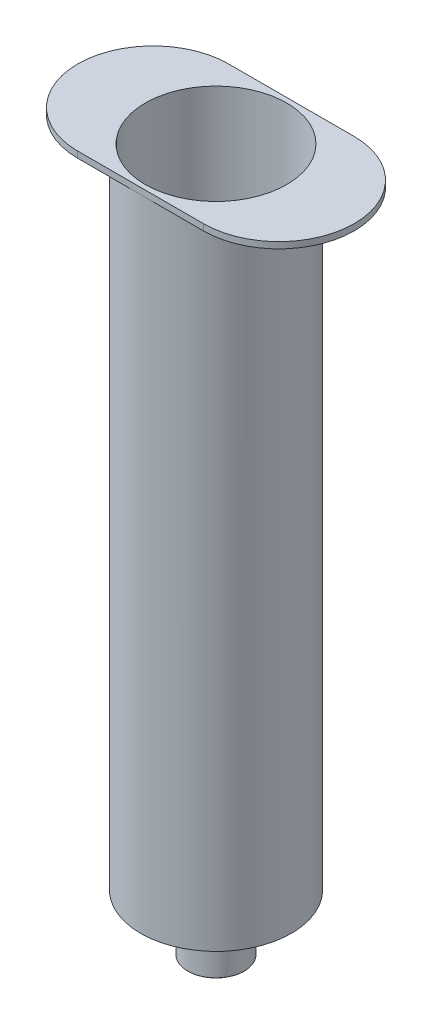
ISO-10303-21;
HEADER;
FILE_DESCRIPTION(('STEP AP214'),'2;1');
FILE_NAME('part.step','',(''),(''),'','','');
FILE_SCHEMA(('AUTOMOTIVE_DESIGN { 1 0 10303 214 1 1 1 1 }'));
ENDSEC;
DATA;
#1=APPLICATION_CONTEXT('core data for automotive mechanical design processes');
#2=APPLICATION_PROTOCOL_DEFINITION('international standard','automotive_design',2000,#1);
#3=PRODUCT_CONTEXT('',#1,'mechanical');
#4=PRODUCT('Part','Part','',(#3));
#5=PRODUCT_RELATED_PRODUCT_CATEGORY('part','',(#4));
#6=PRODUCT_DEFINITION_FORMATION('','',#4);
#7=PRODUCT_DEFINITION_CONTEXT('part definition',#1,'design');
#8=PRODUCT_DEFINITION('design','',#6,#7);
#9=PRODUCT_DEFINITION_SHAPE('','',#8);
#10=(LENGTH_UNIT() NAMED_UNIT(*) SI_UNIT(.MILLI.,.METRE.));
#11=(NAMED_UNIT(*) PLANE_ANGLE_UNIT() SI_UNIT($,.RADIAN.));
#12=(NAMED_UNIT(*) SI_UNIT($,.STERADIAN.) SOLID_ANGLE_UNIT());
#13=UNCERTAINTY_MEASURE_WITH_UNIT(LENGTH_MEASURE(1.E-05),#10,'distance_accuracy_value','');
#14=(GEOMETRIC_REPRESENTATION_CONTEXT(3) GLOBAL_UNCERTAINTY_ASSIGNED_CONTEXT((#13)) GLOBAL_UNIT_ASSIGNED_CONTEXT((#10,
#11,#12)) REPRESENTATION_CONTEXT('',''));
#15=CARTESIAN_POINT('',(0.,0.,0.));
#16=DIRECTION('',(0.,0.,1.));
#17=DIRECTION('',(1.,0.,0.));
#18=AXIS2_PLACEMENT_3D('',#15,#16,#17);
#19=CARTESIAN_POINT('',(0.,-6.73205080756888,0.));
#20=DIRECTION('',(0.,1.,0.));
#21=DIRECTION('',(0.,0.,1.));
#22=AXIS2_PLACEMENT_3D('',#19,#20,#21);
#23=CYLINDRICAL_SURFACE('',#22,1.4);
#24=CARTESIAN_POINT('',(0.,-6.53205080756888,0.));
#25=DIRECTION('',(0.,1.,0.));
#26=DIRECTION('',(0.,0.,1.));
#27=AXIS2_PLACEMENT_3D('',#24,#25,#26);
#28=CIRCLE('',#27,1.4);
#29=CARTESIAN_POINT('',(0.,-6.53205080756888,1.4));
#30=VERTEX_POINT('',#29);
#31=EDGE_CURVE('E51',#30,#30,#28,.T.);
#32=ORIENTED_EDGE('',*,*,#31,.T.);
#33=EDGE_LOOP('',(#32));
#34=FACE_BOUND('',#33,.T.);
#35=CARTESIAN_POINT('',(0.,0.26794919243112,0.));
#36=DIRECTION('',(0.,1.,0.));
#37=DIRECTION('',(0.,0.,1.));
#38=AXIS2_PLACEMENT_3D('',#35,#36,#37);
#39=CIRCLE('',#38,1.4);
#40=CARTESIAN_POINT('',(0.,0.26794919243112,1.4));
#41=VERTEX_POINT('',#40);
#42=EDGE_CURVE('E55',#41,#41,#39,.T.);
#43=ORIENTED_EDGE('',*,*,#42,.F.);
#44=EDGE_LOOP('',(#43));
#45=FACE_BOUND('',#44,.T.);
#46=ADVANCED_FACE('F44',(#34,#45),#23,.T.);
#47=CARTESIAN_POINT('',(0.,-6.73205080756888,0.));
#48=DIRECTION('',(0.,1.,0.));
#49=DIRECTION('',(0.,0.,1.));
#50=AXIS2_PLACEMENT_3D('',#47,#48,#49);
#51=PLANE('',#50);
#52=CARTESIAN_POINT('',(0.,-6.73205080756888,0.));
#53=DIRECTION('',(0.,1.,0.));
#54=DIRECTION('',(0.,0.,1.));
#55=AXIS2_PLACEMENT_3D('',#52,#53,#54);
#56=CIRCLE('',#55,1.2);
#57=CARTESIAN_POINT('',(0.,-6.73205080756888,1.2));
#58=VERTEX_POINT('',#57);
#59=EDGE_CURVE('E11',#58,#58,#56,.F.);
#60=ORIENTED_EDGE('',*,*,#59,.T.);
#61=EDGE_LOOP('',(#60));
#62=FACE_BOUND('',#61,.T.);
#63=CARTESIAN_POINT('',(0.,-6.73205080756888,0.));
#64=DIRECTION('',(0.,1.,0.));
#65=DIRECTION('',(0.,0.,1.));
#66=AXIS2_PLACEMENT_3D('',#63,#64,#65);
#67=CIRCLE('',#66,1.);
#68=CARTESIAN_POINT('',(0.,-6.73205080756888,1.));
#69=VERTEX_POINT('',#68);
#70=EDGE_CURVE('E59',#69,#69,#67,.T.);
#71=ORIENTED_EDGE('',*,*,#70,.T.);
#72=EDGE_LOOP('',(#71));
#73=FACE_BOUND('',#72,.T.);
#74=ADVANCED_FACE('F68',(#62,#73),#51,.F.);
#75=CARTESIAN_POINT('',(0.,0.26794919243112,0.));
#76=DIRECTION('',(0.,1.,0.));
#77=DIRECTION('',(0.,0.,1.));
#78=AXIS2_PLACEMENT_3D('',#75,#76,#77);
#79=PLANE('',#78);
#80=CARTESIAN_POINT('',(0.,0.26794919243112,0.));
#81=DIRECTION('',(0.,1.,0.));
#82=DIRECTION('',(0.,0.,1.));
#83=AXIS2_PLACEMENT_3D('',#80,#81,#82);
#84=CIRCLE('',#83,1.);
#85=CARTESIAN_POINT('',(0.,0.26794919243112,1.));
#86=VERTEX_POINT('',#85);
#87=EDGE_CURVE('E62',#86,#86,#84,.T.);
#88=ORIENTED_EDGE('',*,*,#87,.F.);
#89=EDGE_LOOP('',(#88));
#90=FACE_BOUND('',#89,.T.);
#91=ORIENTED_EDGE('',*,*,#42,.T.);
#92=EDGE_LOOP('',(#91));
#93=FACE_BOUND('',#92,.T.);
#94=ADVANCED_FACE('F73',(#90,#93),#79,.T.);
#95=CARTESIAN_POINT('',(0.,-6.73205080756888,0.));
#96=DIRECTION('',(0.,1.,0.));
#97=DIRECTION('',(0.,0.,1.));
#98=AXIS2_PLACEMENT_3D('',#95,#96,#97);
#99=CYLINDRICAL_SURFACE('',#98,1.);
#100=ORIENTED_EDGE('',*,*,#70,.F.);
#101=EDGE_LOOP('',(#100));
#102=FACE_BOUND('',#101,.T.);
#103=ORIENTED_EDGE('',*,*,#87,.T.);
#104=EDGE_LOOP('',(#103));
#105=FACE_BOUND('',#104,.T.);
#106=ADVANCED_FACE('F70',(#102,#105),#99,.F.);
#107=CARTESIAN_POINT('',(0.,-6.53205080756888,0.));
#108=DIRECTION('',(0.,1.,0.));
#109=DIRECTION('',(0.,0.,1.));
#110=AXIS2_PLACEMENT_3D('',#107,#108,#109);
#111=TOROIDAL_SURFACE('',#110,1.2,0.2);
#112=ORIENTED_EDGE('',*,*,#59,.F.);
#113=EDGE_LOOP('',(#112));
#114=FACE_BOUND('',#113,.T.);
#115=ORIENTED_EDGE('',*,*,#31,.F.);
#116=EDGE_LOOP('',(#115));
#117=FACE_BOUND('',#116,.T.);
#118=ADVANCED_FACE('F46',(#114,#117),#111,.T.);
#119=CLOSED_SHELL('',(#46,#74,#94,#106,#118));
#120=MANIFOLD_SOLID_BREP('B2',#119);
#121=CARTESIAN_POINT('',(0.,3.21539030917348,0.));
#122=DIRECTION('',(0.,1.,0.));
#123=DIRECTION('',(0.,0.,1.));
#124=AXIS2_PLACEMENT_3D('',#121,#122,#123);
#125=CONICAL_SURFACE('',#124,12.0000000000002,1.30899693899575);
#126=CARTESIAN_POINT('',(0.,3.21539030917348,0.));
#127=DIRECTION('',(0.,1.,0.));
#128=DIRECTION('',(0.,0.,1.));
#129=AXIS2_PLACEMENT_3D('',#126,#127,#128);
#130=CIRCLE('',#129,12.);
#131=CARTESIAN_POINT('',(0.,3.21539030917348,12.));
#132=VERTEX_POINT('',#131);
#133=EDGE_CURVE('E207',#132,#132,#130,.T.);
#134=ORIENTED_EDGE('',*,*,#133,.F.);
#135=EDGE_LOOP('',(#134));
#136=FACE_BOUND('',#135,.T.);
#137=CARTESIAN_POINT('',(0.,1.20577136594004,0.));
#138=DIRECTION('',(0.,1.,0.));
#139=DIRECTION('',(0.,0.,1.));
#140=AXIS2_PLACEMENT_3D('',#137,#138,#139);
#141=CIRCLE('',#140,4.5);
#142=CARTESIAN_POINT('',(0.,1.20577136594004,4.5));
#143=VERTEX_POINT('',#142);
#144=EDGE_CURVE('E191',#143,#143,#141,.T.);
#145=ORIENTED_EDGE('',*,*,#144,.T.);
#146=EDGE_LOOP('',(#145));
#147=FACE_BOUND('',#146,.T.);
#148=ADVANCED_FACE('F120',(#136,#147),#125,.T.);
#149=CARTESIAN_POINT('',(0.,105.,0.));
#150=DIRECTION('',(0.,-1.,0.));
#151=DIRECTION('',(0.,0.,-1.));
#152=AXIS2_PLACEMENT_3D('',#149,#150,#151);
#153=CYLINDRICAL_SURFACE('',#152,12.);
#154=ORIENTED_EDGE('',*,*,#133,.T.);
#155=EDGE_LOOP('',(#154));
#156=FACE_BOUND('',#155,.T.);
#157=CARTESIAN_POINT('',(0.,105.,0.));
#158=DIRECTION('',(0.,1.,0.));
#159=DIRECTION('',(0.,0.,1.));
#160=AXIS2_PLACEMENT_3D('',#157,#158,#159);
#161=CIRCLE('',#160,12.);
#162=CARTESIAN_POINT('',(0.,105.,12.));
#163=VERTEX_POINT('',#162);
#164=CARTESIAN_POINT('',(0.,105.,-12.));
#165=VERTEX_POINT('',#164);
#166=EDGE_CURVE('E137',#163,#165,#161,.T.);
#167=ORIENTED_EDGE('',*,*,#166,.F.);
#168=EDGE_CURVE('E134',#165,#163,#161,.T.);
#169=ORIENTED_EDGE('',*,*,#168,.F.);
#170=EDGE_LOOP('',(#167,#169));
#171=FACE_BOUND('',#170,.T.);
#172=ADVANCED_FACE('F241',(#156,#171),#153,.T.);
#173=CARTESIAN_POINT('',(0.,3.,0.));
#174=DIRECTION('',(0.,1.,0.));
#175=DIRECTION('',(0.,0.,1.));
#176=AXIS2_PLACEMENT_3D('',#173,#174,#175);
#177=CYLINDRICAL_SURFACE('',#176,11.25);
#178=CARTESIAN_POINT('',(0.,3.,0.));
#179=DIRECTION('',(0.,1.,0.));
#180=DIRECTION('',(0.,0.,1.));
#181=AXIS2_PLACEMENT_3D('',#178,#179,#180);
#182=CIRCLE('',#181,11.25);
#183=CARTESIAN_POINT('',(0.,3.,11.25));
#184=VERTEX_POINT('',#183);
#185=EDGE_CURVE('E203',#184,#184,#182,.T.);
#186=ORIENTED_EDGE('',*,*,#185,.F.);
#187=EDGE_LOOP('',(#186));
#188=FACE_BOUND('',#187,.T.);
#189=CARTESIAN_POINT('',(0.,106.,0.));
#190=DIRECTION('',(0.,1.,0.));
#191=DIRECTION('',(0.,0.,1.));
#192=AXIS2_PLACEMENT_3D('',#189,#190,#191);
#193=CIRCLE('',#192,11.25);
#194=CARTESIAN_POINT('',(0.,106.,11.25));
#195=VERTEX_POINT('',#194);
#196=EDGE_CURVE('E290',#195,#195,#193,.T.);
#197=ORIENTED_EDGE('',*,*,#196,.T.);
#198=EDGE_LOOP('',(#197));
#199=FACE_BOUND('',#198,.T.);
#200=ADVANCED_FACE('F248',(#188,#199),#177,.F.);
#201=CARTESIAN_POINT('',(0.,3.,0.));
#202=DIRECTION('',(0.,1.,0.));
#203=DIRECTION('',(0.,0.,1.));
#204=AXIS2_PLACEMENT_3D('',#201,#202,#203);
#205=PLANE('',#204);
#206=CARTESIAN_POINT('',(0.,3.,0.));
#207=DIRECTION('',(0.,1.,0.));
#208=DIRECTION('',(0.,0.,1.));
#209=AXIS2_PLACEMENT_3D('',#206,#207,#208);
#210=CIRCLE('',#209,1.);
#211=CARTESIAN_POINT('',(0.,3.,1.));
#212=VERTEX_POINT('',#211);
#213=EDGE_CURVE('E200',#212,#212,#210,.T.);
#214=ORIENTED_EDGE('',*,*,#213,.F.);
#215=EDGE_LOOP('',(#214));
#216=FACE_BOUND('',#215,.T.);
#217=ORIENTED_EDGE('',*,*,#185,.T.);
#218=EDGE_LOOP('',(#217));
#219=FACE_BOUND('',#218,.T.);
#220=ADVANCED_FACE('F255',(#216,#219),#205,.T.);
#221=CARTESIAN_POINT('',(0.,1.07179676972448,0.));
#222=DIRECTION('',(0.,1.,0.));
#223=DIRECTION('',(0.,0.,1.));
#224=AXIS2_PLACEMENT_3D('',#221,#222,#223);
#225=CIRCLE('',#224,4.);
#226=CARTESIAN_POINT('',(0.,1.07179676972448,4.));
#227=VERTEX_POINT('',#226);
#228=EDGE_CURVE('E210',#227,#227,#225,.T.);
#229=CARTESIAN_POINT('',(0.,0.26794919243112,0.));
#230=DIRECTION('',(0.,1.,0.));
#231=DIRECTION('',(0.,0.,1.));
#232=AXIS2_PLACEMENT_3D('',#229,#230,#231);
#233=CIRCLE('',#232,1.);
#234=CARTESIAN_POINT('',(0.,0.26794919243112,0.999999999999997));
#235=VERTEX_POINT('',#234);
#236=EDGE_CURVE('E194',#235,#235,#233,.F.);
#237=CARTESIAN_POINT('',(0.,1.07179676972448,4.));
#238=CARTESIAN_POINT('',(0.,1.06342335746101,3.96875));
#239=CARTESIAN_POINT('',(0.,1.05504994519753,3.9375));
#240=CARTESIAN_POINT('',(0.,1.03830312067059,3.875));
#241=CARTESIAN_POINT('',(0.,1.02992970840712,3.84375));
#242=CARTESIAN_POINT('',(0.,1.01318288388017,3.78125));
#243=CARTESIAN_POINT('',(0.,1.0048094716167,3.75));
#244=CARTESIAN_POINT('',(0.,0.988062647089754,3.6875));
#245=CARTESIAN_POINT('',(0.,0.979689234826281,3.65625));
#246=CARTESIAN_POINT('',(0.,0.962942410299336,3.59375));
#247=CARTESIAN_POINT('',(0.,0.954568998035863,3.5625));
#248=CARTESIAN_POINT('',(0.,0.937822173508919,3.5));
#249=CARTESIAN_POINT('',(0.,0.929448761245446,3.46875));
#250=CARTESIAN_POINT('',(0.,0.912701936718501,3.40625));
#251=CARTESIAN_POINT('',(0.,0.904328524455029,3.375));
#252=CARTESIAN_POINT('',(0.,0.887581699928084,3.3125));
#253=CARTESIAN_POINT('',(0.,0.879208287664611,3.28125));
#254=CARTESIAN_POINT('',(0.,0.862461463137666,3.21875));
#255=CARTESIAN_POINT('',(0.,0.854088050874194,3.1875));
#256=CARTESIAN_POINT('',(0.,0.837341226347249,3.125));
#257=CARTESIAN_POINT('',(0.,0.828967814083776,3.09375));
#258=CARTESIAN_POINT('',(0.,0.812220989556831,3.03125));
#259=CARTESIAN_POINT('',(0.,0.803847577293359,3.));
#260=CARTESIAN_POINT('',(0.,0.787100752766414,2.9375));
#261=CARTESIAN_POINT('',(0.,0.778727340502941,2.90625));
#262=CARTESIAN_POINT('',(0.,0.761980515975996,2.84375));
#263=CARTESIAN_POINT('',(0.,0.753607103712524,2.8125));
#264=CARTESIAN_POINT('',(0.,0.736860279185579,2.75));
#265=CARTESIAN_POINT('',(0.,0.728486866922107,2.71875));
#266=CARTESIAN_POINT('',(0.,0.711740042395162,2.65625));
#267=CARTESIAN_POINT('',(0.,0.703366630131689,2.625));
#268=CARTESIAN_POINT('',(0.,0.686619805604744,2.5625));
#269=CARTESIAN_POINT('',(0.,0.678246393341272,2.53125));
#270=CARTESIAN_POINT('',(0.,0.661499568814326,2.46875));
#271=CARTESIAN_POINT('',(0.,0.653126156550854,2.4375));
#272=CARTESIAN_POINT('',(0.,0.636379332023909,2.375));
#273=CARTESIAN_POINT('',(0.,0.628005919760437,2.34375));
#274=CARTESIAN_POINT('',(0.,0.611259095233492,2.28125));
#275=CARTESIAN_POINT('',(0.,0.602885682970019,2.25));
#276=CARTESIAN_POINT('',(0.,0.586138858443074,2.1875));
#277=CARTESIAN_POINT('',(0.,0.577765446179602,2.15625));
#278=CARTESIAN_POINT('',(0.,0.561018621652657,2.09375));
#279=CARTESIAN_POINT('',(0.,0.552645209389184,2.0625));
#280=CARTESIAN_POINT('',(0.,0.535898384862239,2.));
#281=CARTESIAN_POINT('',(0.,0.527524972598767,1.96875));
#282=CARTESIAN_POINT('',(0.,0.510778148071822,1.90625));
#283=CARTESIAN_POINT('',(0.,0.50240473580835,1.875));
#284=CARTESIAN_POINT('',(0.,0.485657911281404,1.8125));
#285=CARTESIAN_POINT('',(0.,0.477284499017932,1.78125));
#286=CARTESIAN_POINT('',(0.,0.460537674490987,1.71875));
#287=CARTESIAN_POINT('',(0.,0.452164262227514,1.6875));
#288=CARTESIAN_POINT('',(0.,0.435417437700569,1.625));
#289=CARTESIAN_POINT('',(0.,0.427044025437097,1.59375));
#290=CARTESIAN_POINT('',(0.,0.410297200910152,1.53125));
#291=CARTESIAN_POINT('',(0.,0.401923788646679,1.5));
#292=CARTESIAN_POINT('',(0.,0.385176964119735,1.4375));
#293=CARTESIAN_POINT('',(0.,0.376803551856262,1.40625));
#294=CARTESIAN_POINT('',(0.,0.360056727329317,1.34375));
#295=CARTESIAN_POINT('',(0.,0.351683315065844,1.3125));
#296=CARTESIAN_POINT('',(0.,0.3349364905389,1.25));
#297=CARTESIAN_POINT('',(0.,0.326563078275427,1.21875));
#298=CARTESIAN_POINT('',(0.,0.309816253748482,1.15625));
#299=CARTESIAN_POINT('',(0.,0.30144284148501,1.125));
#300=CARTESIAN_POINT('',(0.,0.284696016958065,1.0625));
#301=CARTESIAN_POINT('',(0.,0.276322604694592,1.03125));
#302=CARTESIAN_POINT('',(0.,0.26794919243112,0.999999999999997));
#303=B_SPLINE_CURVE_WITH_KNOTS('',3,(#237,#238,#239,#240,#241,#242,#243,#244,#245,#246,#247,
#248,#249,#250,#251,#252,#253,#254,#255,#256,#257,#258,#259,#260,#261,#262,#263,#264,#265,#266,
#267,#268,#269,#270,#271,#272,#273,#274,#275,#276,#277,#278,#279,#280,#281,#282,#283,#284,#285,
#286,#287,#288,#289,#290,#291,#292,#293,#294,#295,#296,#297,#298,#299,#300,#301,#302),
.UNSPECIFIED.,.F.,.F.,(4,2,2,2,2,2,2,2,2,2,2,2,2,2,2,2,2,2,2,2,2,2,2,2,2,2,2,2,2,2,2,2,4),(0.,
0.0970571419134453,0.194114283826891,0.291171425740336,0.388228567653781,0.485285709567226,
0.58234285148067,0.679399993394115,0.776457135307562,0.873514277221008,0.970571419134453,
1.0676285610479,1.16468570296134,1.26174284487479,1.35879998678823,1.45585712870168,
1.55291427061512,1.64997141252857,1.74702855444202,1.84408569635546,1.9411428382689,
2.03819998018235,2.13525712209579,2.23231426400924,2.32937140592268,2.42642854783613,
2.52348568974958,2.62054283166302,2.71759997357647,2.81465711548991,2.91171425740335,
3.0087713993168,3.10582854123025),.UNSPECIFIED.);
#304=EDGE_CURVE('BSEAM244',#227,#235,#303,.T.);
#305=ORIENTED_EDGE('',*,*,#228,.F.);
#306=ORIENTED_EDGE('',*,*,#236,.F.);
#307=ORIENTED_EDGE('',*,*,#304,.T.);
#308=ORIENTED_EDGE('',*,*,#304,.F.);
#309=EDGE_LOOP('',(#305,#307,#306,#308));
#310=FACE_BOUND('',#309,.T.);
#311=ADVANCED_FACE('F244',(#310),#125,.T.);
#312=CARTESIAN_POINT('',(0.,-11.,0.));
#313=DIRECTION('',(0.,1.,0.));
#314=DIRECTION('',(0.,0.,1.));
#315=AXIS2_PLACEMENT_3D('',#312,#313,#314);
#316=CYLINDRICAL_SURFACE('',#315,1.);
#317=ORIENTED_EDGE('',*,*,#213,.T.);
#318=EDGE_LOOP('',(#317));
#319=FACE_BOUND('',#318,.T.);
#320=ORIENTED_EDGE('',*,*,#236,.T.);
#321=EDGE_LOOP('',(#320));
#322=FACE_BOUND('',#321,.T.);
#323=ADVANCED_FACE('F254',(#319,#322),#316,.F.);
#324=CARTESIAN_POINT('',(0.,1.26794919243112,0.));
#325=DIRECTION('',(0.,-1.,0.));
#326=DIRECTION('',(0.,0.,-1.));
#327=AXIS2_PLACEMENT_3D('',#324,#325,#326);
#328=CYLINDRICAL_SURFACE('',#327,4.5);
#329=CARTESIAN_POINT('',(0.,-5.72205080756888,0.));
#330=DIRECTION('',(0.,-1.,0.));
#331=DIRECTION('',(0.,0.,-1.));
#332=AXIS2_PLACEMENT_3D('',#329,#330,#331);
#333=CIRCLE('',#332,4.5);
#334=CARTESIAN_POINT('',(0.,-5.72205080756888,-4.5));
#335=VERTEX_POINT('',#334);
#336=EDGE_CURVE('E218',#335,#335,#333,.F.);
#337=ORIENTED_EDGE('',*,*,#336,.T.);
#338=EDGE_LOOP('',(#337));
#339=FACE_BOUND('',#338,.T.);
#340=ORIENTED_EDGE('',*,*,#144,.F.);
#341=EDGE_LOOP('',(#340));
#342=FACE_BOUND('',#341,.T.);
#343=ADVANCED_FACE('F261',(#339,#342),#328,.T.);
#344=CARTESIAN_POINT('',(0.,1.26794919243112,0.));
#345=DIRECTION('',(0.,-1.,0.));
#346=DIRECTION('',(0.,0.,-1.));
#347=AXIS2_PLACEMENT_3D('',#344,#345,#346);
#348=CYLINDRICAL_SURFACE('',#347,4.);
#349=CARTESIAN_POINT('',(0.,-5.72205080756888,0.));
#350=DIRECTION('',(0.,-1.,0.));
#351=DIRECTION('',(0.,0.,-1.));
#352=AXIS2_PLACEMENT_3D('',#349,#350,#351);
#353=CIRCLE('',#352,4.);
#354=CARTESIAN_POINT('',(0.,-5.72205080756888,-4.));
#355=VERTEX_POINT('',#354);
#356=EDGE_CURVE('E128',#355,#355,#353,.T.);
#357=ORIENTED_EDGE('',*,*,#356,.T.);
#358=EDGE_LOOP('',(#357));
#359=FACE_BOUND('',#358,.T.);
#360=ORIENTED_EDGE('',*,*,#228,.T.);
#361=EDGE_LOOP('',(#360));
#362=FACE_BOUND('',#361,.T.);
#363=ADVANCED_FACE('F223',(#359,#362),#348,.F.);
#364=CARTESIAN_POINT('',(0.,-5.77205080756888,0.));
#365=DIRECTION('',(0.,-1.,0.));
#366=DIRECTION('',(0.,0.,-1.));
#367=AXIS2_PLACEMENT_3D('',#364,#365,#366);
#368=PLANE('',#367);
#369=CARTESIAN_POINT('',(0.,-5.77205080756888,0.));
#370=DIRECTION('',(0.,-1.,0.));
#371=DIRECTION('',(0.,0.,-1.));
#372=AXIS2_PLACEMENT_3D('',#369,#370,#371);
#373=CIRCLE('',#372,4.05);
#374=CARTESIAN_POINT('',(0.,-5.77205080756888,-4.05));
#375=VERTEX_POINT('',#374);
#376=EDGE_CURVE('E42',#375,#375,#373,.F.);
#377=ORIENTED_EDGE('',*,*,#376,.T.);
#378=EDGE_LOOP('',(#377));
#379=FACE_BOUND('',#378,.T.);
#380=CARTESIAN_POINT('',(0.,-5.77205080756888,0.));
#381=DIRECTION('',(0.,-1.,0.));
#382=DIRECTION('',(0.,0.,-1.));
#383=AXIS2_PLACEMENT_3D('',#380,#381,#382);
#384=CIRCLE('',#383,4.45);
#385=CARTESIAN_POINT('',(0.,-5.77205080756888,-4.45));
#386=VERTEX_POINT('',#385);
#387=EDGE_CURVE('E214',#386,#386,#384,.T.);
#388=ORIENTED_EDGE('',*,*,#387,.T.);
#389=EDGE_LOOP('',(#388));
#390=FACE_BOUND('',#389,.T.);
#391=ADVANCED_FACE('F237',(#379,#390),#368,.T.);
#392=CARTESIAN_POINT('',(0.,-5.72205080756888,0.));
#393=DIRECTION('',(0.,-1.,0.));
#394=DIRECTION('',(0.,0.,-1.));
#395=AXIS2_PLACEMENT_3D('',#392,#393,#394);
#396=TOROIDAL_SURFACE('',#395,4.45,0.05);
#397=ORIENTED_EDGE('',*,*,#336,.F.);
#398=EDGE_LOOP('',(#397));
#399=FACE_BOUND('',#398,.T.);
#400=ORIENTED_EDGE('',*,*,#387,.F.);
#401=EDGE_LOOP('',(#400));
#402=FACE_BOUND('',#401,.T.);
#403=ADVANCED_FACE('F228',(#399,#402),#396,.T.);
#404=CARTESIAN_POINT('',(0.,-5.72205080756888,0.));
#405=DIRECTION('',(0.,-1.,0.));
#406=DIRECTION('',(0.,0.,-1.));
#407=AXIS2_PLACEMENT_3D('',#404,#405,#406);
#408=TOROIDAL_SURFACE('',#407,4.05,0.05);
#409=ORIENTED_EDGE('',*,*,#376,.F.);
#410=EDGE_LOOP('',(#409));
#411=FACE_BOUND('',#410,.T.);
#412=ORIENTED_EDGE('',*,*,#356,.F.);
#413=EDGE_LOOP('',(#412));
#414=FACE_BOUND('',#413,.T.);
#415=ADVANCED_FACE('F122',(#411,#414),#408,.T.);
#416=CARTESIAN_POINT('',(-10.,105.,0.));
#417=DIRECTION('',(0.,1.,0.));
#418=DIRECTION('',(0.,0.,1.));
#419=AXIS2_PLACEMENT_3D('',#416,#417,#418);
#420=PLANE('',#419);
#421=DIRECTION('',(1.,0.,0.));
#422=VECTOR('',#421,1.);
#423=CARTESIAN_POINT('',(-10.,105.,12.));
#424=LINE('',#423,#422);
#425=CARTESIAN_POINT('',(10.,105.,12.));
#426=VERTEX_POINT('',#425);
#427=EDGE_CURVE('E292',#163,#426,#424,.T.);
#428=ORIENTED_EDGE('',*,*,#427,.F.);
#429=ORIENTED_EDGE('',*,*,#166,.T.);
#430=DIRECTION('',(-1.,0.,0.));
#431=VECTOR('',#430,1.);
#432=CARTESIAN_POINT('',(-10.,105.,-12.));
#433=LINE('',#432,#431);
#434=CARTESIAN_POINT('',(10.,105.,-12.));
#435=VERTEX_POINT('',#434);
#436=EDGE_CURVE('E186',#435,#165,#433,.T.);
#437=ORIENTED_EDGE('',*,*,#436,.F.);
#438=CARTESIAN_POINT('',(10.,105.,0.));
#439=DIRECTION('',(0.,1.,0.));
#440=DIRECTION('',(0.,0.,1.));
#441=AXIS2_PLACEMENT_3D('',#438,#439,#440);
#442=CIRCLE('',#441,12.);
#443=EDGE_CURVE('E300',#426,#435,#442,.T.);
#444=ORIENTED_EDGE('',*,*,#443,.F.);
#445=EDGE_LOOP('',(#428,#429,#437,#444));
#446=FACE_BOUND('',#445,.T.);
#447=ADVANCED_FACE('F227',(#446),#420,.F.);
#448=CARTESIAN_POINT('',(-10.,105.,-12.));
#449=VERTEX_POINT('',#448);
#450=EDGE_CURVE('E302',#165,#449,#433,.T.);
#451=ORIENTED_EDGE('',*,*,#450,.F.);
#452=ORIENTED_EDGE('',*,*,#168,.T.);
#453=CARTESIAN_POINT('',(-10.,105.,12.));
#454=VERTEX_POINT('',#453);
#455=EDGE_CURVE('E298',#454,#163,#424,.T.);
#456=ORIENTED_EDGE('',*,*,#455,.F.);
#457=CARTESIAN_POINT('',(-10.,105.,0.));
#458=DIRECTION('',(0.,1.,0.));
#459=DIRECTION('',(0.,0.,1.));
#460=AXIS2_PLACEMENT_3D('',#457,#458,#459);
#461=CIRCLE('',#460,12.);
#462=EDGE_CURVE('E190',#449,#454,#461,.T.);
#463=ORIENTED_EDGE('',*,*,#462,.F.);
#464=EDGE_LOOP('',(#451,#452,#456,#463));
#465=FACE_BOUND('',#464,.T.);
#466=ADVANCED_FACE('F234',(#465),#420,.F.);
#467=CARTESIAN_POINT('',(-10.,106.,0.));
#468=DIRECTION('',(0.,1.,0.));
#469=DIRECTION('',(0.,0.,1.));
#470=AXIS2_PLACEMENT_3D('',#467,#468,#469);
#471=PLANE('',#470);
#472=CARTESIAN_POINT('',(-10.,106.,0.));
#473=DIRECTION('',(0.,1.,0.));
#474=DIRECTION('',(0.,0.,1.));
#475=AXIS2_PLACEMENT_3D('',#472,#473,#474);
#476=CIRCLE('',#475,12.);
#477=CARTESIAN_POINT('',(-10.,106.,-12.));
#478=VERTEX_POINT('',#477);
#479=CARTESIAN_POINT('',(-10.,106.,12.));
#480=VERTEX_POINT('',#479);
#481=EDGE_CURVE('E176',#478,#480,#476,.T.);
#482=ORIENTED_EDGE('',*,*,#481,.T.);
#483=DIRECTION('',(1.,0.,0.));
#484=VECTOR('',#483,1.);
#485=CARTESIAN_POINT('',(-10.,106.,12.));
#486=LINE('',#485,#484);
#487=CARTESIAN_POINT('',(10.,106.,12.));
#488=VERTEX_POINT('',#487);
#489=EDGE_CURVE('E164',#480,#488,#486,.T.);
#490=ORIENTED_EDGE('',*,*,#489,.T.);
#491=CARTESIAN_POINT('',(10.,106.,0.));
#492=DIRECTION('',(0.,1.,0.));
#493=DIRECTION('',(0.,0.,1.));
#494=AXIS2_PLACEMENT_3D('',#491,#492,#493);
#495=CIRCLE('',#494,12.);
#496=CARTESIAN_POINT('',(10.,106.,-12.));
#497=VERTEX_POINT('',#496);
#498=EDGE_CURVE('E175',#488,#497,#495,.T.);
#499=ORIENTED_EDGE('',*,*,#498,.T.);
#500=DIRECTION('',(-1.,0.,0.));
#501=VECTOR('',#500,1.);
#502=CARTESIAN_POINT('',(-10.,106.,-12.));
#503=LINE('',#502,#501);
#504=EDGE_CURVE('E182',#497,#478,#503,.T.);
#505=ORIENTED_EDGE('',*,*,#504,.T.);
#506=EDGE_LOOP('',(#482,#490,#499,#505));
#507=FACE_BOUND('',#506,.T.);
#508=ORIENTED_EDGE('',*,*,#196,.F.);
#509=EDGE_LOOP('',(#508));
#510=FACE_BOUND('',#509,.T.);
#511=ADVANCED_FACE('F179',(#507,#510),#471,.T.);
#512=CARTESIAN_POINT('',(-10.,106.,0.));
#513=DIRECTION('',(0.,-1.,0.));
#514=DIRECTION('',(0.,0.,-1.));
#515=AXIS2_PLACEMENT_3D('',#512,#513,#514);
#516=CYLINDRICAL_SURFACE('',#515,12.);
#517=ORIENTED_EDGE('',*,*,#462,.T.);
#518=DIRECTION('',(0.,-1.,0.));
#519=VECTOR('',#518,1.);
#520=CARTESIAN_POINT('',(-10.,106.,12.));
#521=LINE('',#520,#519);
#522=EDGE_CURVE('E169',#480,#454,#521,.T.);
#523=ORIENTED_EDGE('',*,*,#522,.F.);
#524=ORIENTED_EDGE('',*,*,#481,.F.);
#525=DIRECTION('',(0.,-1.,0.));
#526=VECTOR('',#525,1.);
#527=CARTESIAN_POINT('',(-10.,106.,-12.));
#528=LINE('',#527,#526);
#529=EDGE_CURVE('E296',#478,#449,#528,.T.);
#530=ORIENTED_EDGE('',*,*,#529,.T.);
#531=EDGE_LOOP('',(#517,#523,#524,#530));
#532=FACE_BOUND('',#531,.T.);
#533=ADVANCED_FACE('F188',(#532),#516,.T.);
#534=CARTESIAN_POINT('',(-10.,106.,12.));
#535=DIRECTION('',(0.,0.,-1.));
#536=DIRECTION('',(-1.,0.,0.));
#537=AXIS2_PLACEMENT_3D('',#534,#535,#536);
#538=PLANE('',#537);
#539=ORIENTED_EDGE('',*,*,#455,.T.);
#540=ORIENTED_EDGE('',*,*,#427,.T.);
#541=DIRECTION('',(0.,-1.,0.));
#542=VECTOR('',#541,1.);
#543=CARTESIAN_POINT('',(10.,106.,12.));
#544=LINE('',#543,#542);
#545=EDGE_CURVE('E172',#488,#426,#544,.T.);
#546=ORIENTED_EDGE('',*,*,#545,.F.);
#547=ORIENTED_EDGE('',*,*,#489,.F.);
#548=ORIENTED_EDGE('',*,*,#522,.T.);
#549=EDGE_LOOP('',(#539,#540,#546,#547,#548));
#550=FACE_BOUND('',#549,.T.);
#551=ADVANCED_FACE('F167',(#550),#538,.F.);
#552=CARTESIAN_POINT('',(10.,106.,0.));
#553=DIRECTION('',(0.,-1.,0.));
#554=DIRECTION('',(0.,0.,-1.));
#555=AXIS2_PLACEMENT_3D('',#552,#553,#554);
#556=CYLINDRICAL_SURFACE('',#555,12.);
#557=ORIENTED_EDGE('',*,*,#443,.T.);
#558=DIRECTION('',(0.,-1.,0.));
#559=VECTOR('',#558,1.);
#560=CARTESIAN_POINT('',(10.,106.,-12.));
#561=LINE('',#560,#559);
#562=EDGE_CURVE('E196',#497,#435,#561,.T.);
#563=ORIENTED_EDGE('',*,*,#562,.F.);
#564=ORIENTED_EDGE('',*,*,#498,.F.);
#565=ORIENTED_EDGE('',*,*,#545,.T.);
#566=EDGE_LOOP('',(#557,#563,#564,#565));
#567=FACE_BOUND('',#566,.T.);
#568=ADVANCED_FACE('F315',(#567),#556,.T.);
#569=CARTESIAN_POINT('',(-10.,106.,-12.));
#570=DIRECTION('',(0.,0.,1.));
#571=DIRECTION('',(1.,0.,0.));
#572=AXIS2_PLACEMENT_3D('',#569,#570,#571);
#573=PLANE('',#572);
#574=ORIENTED_EDGE('',*,*,#436,.T.);
#575=ORIENTED_EDGE('',*,*,#450,.T.);
#576=ORIENTED_EDGE('',*,*,#529,.F.);
#577=ORIENTED_EDGE('',*,*,#504,.F.);
#578=ORIENTED_EDGE('',*,*,#562,.T.);
#579=EDGE_LOOP('',(#574,#575,#576,#577,#578));
#580=FACE_BOUND('',#579,.T.);
#581=ADVANCED_FACE('F309',(#580),#573,.F.);
#582=CLOSED_SHELL('',(#148,#172,#200,#220,#311,#323,#343,#363,#391,#403,#415,#447,#466,#511,
#533,#551,#568,#581));
#583=MANIFOLD_SOLID_BREP('B6',#582);
#584=ADVANCED_BREP_SHAPE_REPRESENTATION('',(#18,#120,#583),#14);
#585=SHAPE_DEFINITION_REPRESENTATION(#9,#584);
ENDSEC;
END-ISO-10303-21;
